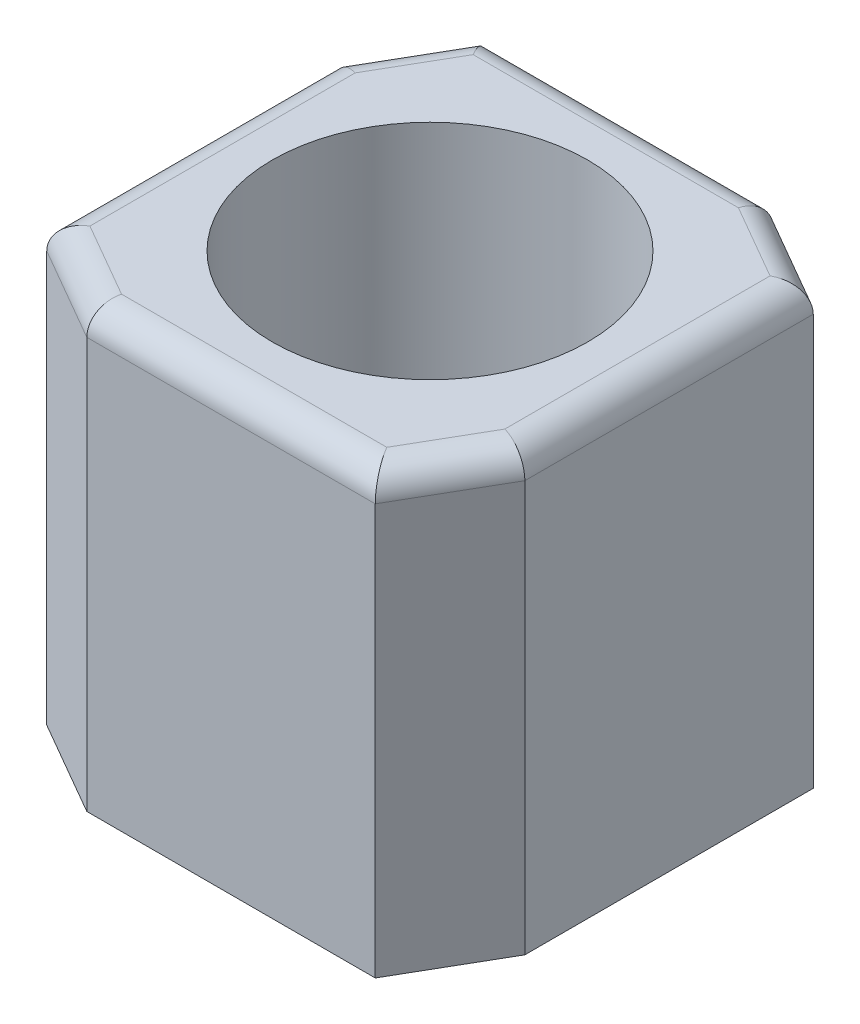
ISO-10303-21;
HEADER;
FILE_DESCRIPTION(('STEP AP214'),'2;1');
FILE_NAME('part.step','',(''),(''),'','','');
FILE_SCHEMA(('AUTOMOTIVE_DESIGN { 1 0 10303 214 1 1 1 1 }'));
ENDSEC;
DATA;
#1=APPLICATION_CONTEXT('core data for automotive mechanical design processes');
#2=APPLICATION_PROTOCOL_DEFINITION('international standard','automotive_design',2000,#1);
#3=PRODUCT_CONTEXT('',#1,'mechanical');
#4=PRODUCT('Part','Part','',(#3));
#5=PRODUCT_RELATED_PRODUCT_CATEGORY('part','',(#4));
#6=PRODUCT_DEFINITION_FORMATION('','',#4);
#7=PRODUCT_DEFINITION_CONTEXT('part definition',#1,'design');
#8=PRODUCT_DEFINITION('design','',#6,#7);
#9=PRODUCT_DEFINITION_SHAPE('','',#8);
#10=(LENGTH_UNIT() NAMED_UNIT(*) SI_UNIT(.MILLI.,.METRE.));
#11=(NAMED_UNIT(*) PLANE_ANGLE_UNIT() SI_UNIT($,.RADIAN.));
#12=(NAMED_UNIT(*) SI_UNIT($,.STERADIAN.) SOLID_ANGLE_UNIT());
#13=UNCERTAINTY_MEASURE_WITH_UNIT(LENGTH_MEASURE(1.E-05),#10,'distance_accuracy_value','');
#14=(GEOMETRIC_REPRESENTATION_CONTEXT(3) GLOBAL_UNCERTAINTY_ASSIGNED_CONTEXT((#13)) GLOBAL_UNIT_ASSIGNED_CONTEXT((#10,
#11,#12)) REPRESENTATION_CONTEXT('',''));
#15=CARTESIAN_POINT('',(0.,0.,0.));
#16=DIRECTION('',(0.,0.,1.));
#17=DIRECTION('',(1.,0.,0.));
#18=AXIS2_PLACEMENT_3D('',#15,#16,#17);
#19=CARTESIAN_POINT('',(0.,6.35,0.));
#20=DIRECTION('',(0.,-1.,0.));
#21=DIRECTION('',(0.,0.,-1.));
#22=AXIS2_PLACEMENT_3D('',#19,#20,#21);
#23=PLANE('',#22);
#24=DIRECTION('',(-1.,0.,0.));
#25=VECTOR('',#24,1.);
#26=CARTESIAN_POINT('',(0.,6.35,-2.778125));
#27=LINE('',#26,#25);
#28=CARTESIAN_POINT('',(1.6938423357461,6.35,-2.778125));
#29=VERTEX_POINT('',#28);
#30=CARTESIAN_POINT('',(-2.15211411191536,6.35,-2.778125));
#31=VERTEX_POINT('',#30);
#32=EDGE_CURVE('E198',#29,#31,#27,.T.);
#33=ORIENTED_EDGE('',*,*,#32,.T.);
#34=DIRECTION('',(0.500000000000001,0.,-0.866025403784438));
#35=VECTOR('',#34,1.);
#36=CARTESIAN_POINT('',(-2.83129616787305,6.35,-1.6017471714922));
#37=LINE('',#36,#35);
#38=CARTESIAN_POINT('',(-2.778125,6.35,-1.6938423357461));
#39=VERTEX_POINT('',#38);
#40=EDGE_CURVE('E200',#31,#39,#37,.F.);
#41=ORIENTED_EDGE('',*,*,#40,.T.);
#42=DIRECTION('',(0.,0.,1.));
#43=VECTOR('',#42,1.);
#44=CARTESIAN_POINT('',(-2.778125,6.35,0.));
#45=LINE('',#44,#43);
#46=CARTESIAN_POINT('',(-2.778125,6.35,2.15211411191536));
#47=VERTEX_POINT('',#46);
#48=EDGE_CURVE('E191',#39,#47,#45,.T.);
#49=ORIENTED_EDGE('',*,*,#48,.T.);
#50=DIRECTION('',(-0.866025403784438,0.,-0.500000000000001));
#51=VECTOR('',#50,1.);
#52=CARTESIAN_POINT('',(-1.6017471714922,6.35,2.83129616787305));
#53=LINE('',#52,#51);
#54=CARTESIAN_POINT('',(-1.6938423357461,6.35,2.778125));
#55=VERTEX_POINT('',#54);
#56=EDGE_CURVE('E185',#47,#55,#53,.F.);
#57=ORIENTED_EDGE('',*,*,#56,.T.);
#58=DIRECTION('',(1.,0.,0.));
#59=VECTOR('',#58,1.);
#60=CARTESIAN_POINT('',(0.,6.35,2.778125));
#61=LINE('',#60,#59);
#62=CARTESIAN_POINT('',(2.15211411191537,6.35,2.778125));
#63=VERTEX_POINT('',#62);
#64=EDGE_CURVE('E187',#55,#63,#61,.T.);
#65=ORIENTED_EDGE('',*,*,#64,.T.);
#66=DIRECTION('',(-0.500000000000001,0.,0.866025403784438));
#67=VECTOR('',#66,1.);
#68=CARTESIAN_POINT('',(2.83129616787305,6.35,1.6017471714922));
#69=LINE('',#68,#67);
#70=CARTESIAN_POINT('',(2.778125,6.35,1.6938423357461));
#71=VERTEX_POINT('',#70);
#72=EDGE_CURVE('E189',#63,#71,#69,.F.);
#73=ORIENTED_EDGE('',*,*,#72,.T.);
#74=DIRECTION('',(0.,0.,-1.));
#75=VECTOR('',#74,1.);
#76=CARTESIAN_POINT('',(2.778125,6.35,0.));
#77=LINE('',#76,#75);
#78=CARTESIAN_POINT('',(2.778125,6.35,-2.15211411191537));
#79=VERTEX_POINT('',#78);
#80=EDGE_CURVE('E193',#71,#79,#77,.T.);
#81=ORIENTED_EDGE('',*,*,#80,.T.);
#82=DIRECTION('',(0.866025403784438,0.,0.5));
#83=VECTOR('',#82,1.);
#84=CARTESIAN_POINT('',(1.6017471714922,6.35,-2.83129616787305));
#85=LINE('',#84,#83);
#86=EDGE_CURVE('E196',#79,#29,#85,.F.);
#87=ORIENTED_EDGE('',*,*,#86,.T.);
#88=EDGE_LOOP('',(#33,#41,#49,#57,#65,#73,#81,#87));
#89=FACE_BOUND('',#88,.T.);
#90=CARTESIAN_POINT('',(0.,6.35,0.));
#91=DIRECTION('',(0.,1.,0.));
#92=DIRECTION('',(0.,0.,1.));
#93=AXIS2_PLACEMENT_3D('',#90,#91,#92);
#94=CIRCLE('',#93,2.286);
#95=CARTESIAN_POINT('',(0.,6.35,2.286));
#96=VERTEX_POINT('',#95);
#97=EDGE_CURVE('E237',#96,#96,#94,.T.);
#98=ORIENTED_EDGE('',*,*,#97,.F.);
#99=EDGE_LOOP('',(#98));
#100=FACE_BOUND('',#99,.T.);
#101=ADVANCED_FACE('F41',(#89,#100),#23,.F.);
#102=CARTESIAN_POINT('',(0.,0.,0.));
#103=DIRECTION('',(0.,-1.,0.));
#104=DIRECTION('',(0.,0.,-1.));
#105=AXIS2_PLACEMENT_3D('',#102,#103,#104);
#106=PLANE('',#105);
#107=CARTESIAN_POINT('',(0.,0.,0.));
#108=DIRECTION('',(0.,-1.,0.));
#109=DIRECTION('',(0.,0.,-1.));
#110=AXIS2_PLACEMENT_3D('',#107,#108,#109);
#111=CIRCLE('',#110,2.682875);
#112=CARTESIAN_POINT('',(0.,0.,-2.682875));
#113=VERTEX_POINT('',#112);
#114=EDGE_CURVE('E49',#113,#113,#111,.F.);
#115=ORIENTED_EDGE('',*,*,#114,.T.);
#116=EDGE_LOOP('',(#115));
#117=FACE_BOUND('',#116,.T.);
#118=DIRECTION('',(0.,0.,1.));
#119=VECTOR('',#118,1.);
#120=CARTESIAN_POINT('',(-3.175,0.,3.175));
#121=LINE('',#120,#119);
#122=CARTESIAN_POINT('',(-3.175,0.,-1.8001846714922));
#123=VERTEX_POINT('',#122);
#124=CARTESIAN_POINT('',(-3.175,0.,2.38125));
#125=VERTEX_POINT('',#124);
#126=EDGE_CURVE('E137',#123,#125,#121,.T.);
#127=ORIENTED_EDGE('',*,*,#126,.F.);
#128=DIRECTION('',(-0.500000000000001,0.,0.866025403784438));
#129=VECTOR('',#128,1.);
#130=CARTESIAN_POINT('',(-3.16075282850779,0.,-1.82486149638085));
#131=LINE('',#130,#129);
#132=CARTESIAN_POINT('',(-2.38125,0.,-3.175));
#133=VERTEX_POINT('',#132);
#134=EDGE_CURVE('E147',#123,#133,#131,.F.);
#135=ORIENTED_EDGE('',*,*,#134,.T.);
#136=DIRECTION('',(-1.,0.,0.));
#137=VECTOR('',#136,1.);
#138=CARTESIAN_POINT('',(-3.175,0.,-3.175));
#139=LINE('',#138,#137);
#140=CARTESIAN_POINT('',(1.8001846714922,0.,-3.175));
#141=VERTEX_POINT('',#140);
#142=EDGE_CURVE('E161',#141,#133,#139,.T.);
#143=ORIENTED_EDGE('',*,*,#142,.F.);
#144=DIRECTION('',(-0.866025403784438,0.,-0.5));
#145=VECTOR('',#144,1.);
#146=CARTESIAN_POINT('',(1.82486149638085,0.,-3.1607528285078));
#147=LINE('',#146,#145);
#148=CARTESIAN_POINT('',(3.175,0.,-2.38125));
#149=VERTEX_POINT('',#148);
#150=EDGE_CURVE('E155',#141,#149,#147,.F.);
#151=ORIENTED_EDGE('',*,*,#150,.T.);
#152=DIRECTION('',(0.,0.,-1.));
#153=VECTOR('',#152,1.);
#154=CARTESIAN_POINT('',(3.175,0.,3.175));
#155=LINE('',#154,#153);
#156=CARTESIAN_POINT('',(3.175,0.,1.8001846714922));
#157=VERTEX_POINT('',#156);
#158=EDGE_CURVE('E165',#157,#149,#155,.T.);
#159=ORIENTED_EDGE('',*,*,#158,.F.);
#160=DIRECTION('',(0.500000000000001,0.,-0.866025403784438));
#161=VECTOR('',#160,1.);
#162=CARTESIAN_POINT('',(3.16075282850779,0.,1.82486149638085));
#163=LINE('',#162,#161);
#164=CARTESIAN_POINT('',(2.38125,0.,3.175));
#165=VERTEX_POINT('',#164);
#166=EDGE_CURVE('E171',#157,#165,#163,.F.);
#167=ORIENTED_EDGE('',*,*,#166,.T.);
#168=DIRECTION('',(1.,0.,0.));
#169=VECTOR('',#168,1.);
#170=CARTESIAN_POINT('',(-3.175,0.,3.175));
#171=LINE('',#170,#169);
#172=CARTESIAN_POINT('',(-1.8001846714922,0.,3.175));
#173=VERTEX_POINT('',#172);
#174=EDGE_CURVE('E160',#173,#165,#171,.T.);
#175=ORIENTED_EDGE('',*,*,#174,.F.);
#176=DIRECTION('',(0.866025403784438,0.,0.500000000000001));
#177=VECTOR('',#176,1.);
#178=CARTESIAN_POINT('',(-1.82486149638085,0.,3.16075282850779));
#179=LINE('',#178,#177);
#180=EDGE_CURVE('E143',#173,#125,#179,.F.);
#181=ORIENTED_EDGE('',*,*,#180,.T.);
#182=EDGE_LOOP('',(#127,#135,#143,#151,#159,#167,#175,#181));
#183=FACE_BOUND('',#182,.T.);
#184=ADVANCED_FACE('F157',(#117,#183),#106,.T.);
#185=CARTESIAN_POINT('',(3.175,6.35,3.175));
#186=DIRECTION('',(-1.,0.,0.));
#187=DIRECTION('',(0.,0.,1.));
#188=AXIS2_PLACEMENT_3D('',#185,#186,#187);
#189=PLANE('',#188);
#190=DIRECTION('',(0.,1.,0.));
#191=VECTOR('',#190,1.);
#192=CARTESIAN_POINT('',(3.175,6.35,-2.38125));
#193=LINE('',#192,#191);
#194=CARTESIAN_POINT('',(3.175,5.953125,-2.38125));
#195=VERTEX_POINT('',#194);
#196=EDGE_CURVE('E178',#149,#195,#193,.T.);
#197=ORIENTED_EDGE('',*,*,#196,.T.);
#198=DIRECTION('',(0.,0.,-1.));
#199=VECTOR('',#198,1.);
#200=CARTESIAN_POINT('',(3.175,5.953125,3.175));
#201=LINE('',#200,#199);
#202=CARTESIAN_POINT('',(3.175,5.953125,1.8001846714922));
#203=VERTEX_POINT('',#202);
#204=EDGE_CURVE('E202',#195,#203,#201,.F.);
#205=ORIENTED_EDGE('',*,*,#204,.T.);
#206=DIRECTION('',(0.,-1.,0.));
#207=VECTOR('',#206,1.);
#208=CARTESIAN_POINT('',(3.175,6.35,1.8001846714922));
#209=LINE('',#208,#207);
#210=EDGE_CURVE('E176',#203,#157,#209,.T.);
#211=ORIENTED_EDGE('',*,*,#210,.T.);
#212=ORIENTED_EDGE('',*,*,#158,.T.);
#213=EDGE_LOOP('',(#197,#205,#211,#212));
#214=FACE_BOUND('',#213,.T.);
#215=ADVANCED_FACE('F260',(#214),#189,.F.);
#216=CARTESIAN_POINT('',(-3.175,6.35,-3.175));
#217=DIRECTION('',(0.,0.,1.));
#218=DIRECTION('',(1.,0.,0.));
#219=AXIS2_PLACEMENT_3D('',#216,#217,#218);
#220=PLANE('',#219);
#221=DIRECTION('',(0.,1.,0.));
#222=VECTOR('',#221,1.);
#223=CARTESIAN_POINT('',(-2.38125,6.35,-3.175));
#224=LINE('',#223,#222);
#225=CARTESIAN_POINT('',(-2.38125,5.953125,-3.175));
#226=VERTEX_POINT('',#225);
#227=EDGE_CURVE('E150',#133,#226,#224,.T.);
#228=ORIENTED_EDGE('',*,*,#227,.T.);
#229=DIRECTION('',(-1.,0.,0.));
#230=VECTOR('',#229,1.);
#231=CARTESIAN_POINT('',(-3.175,5.953125,-3.175));
#232=LINE('',#231,#230);
#233=CARTESIAN_POINT('',(1.8001846714922,5.953125,-3.175));
#234=VERTEX_POINT('',#233);
#235=EDGE_CURVE('E208',#226,#234,#232,.F.);
#236=ORIENTED_EDGE('',*,*,#235,.T.);
#237=DIRECTION('',(0.,-1.,0.));
#238=VECTOR('',#237,1.);
#239=CARTESIAN_POINT('',(1.8001846714922,6.35,-3.175));
#240=LINE('',#239,#238);
#241=EDGE_CURVE('E154',#234,#141,#240,.T.);
#242=ORIENTED_EDGE('',*,*,#241,.T.);
#243=ORIENTED_EDGE('',*,*,#142,.T.);
#244=EDGE_LOOP('',(#228,#236,#242,#243));
#245=FACE_BOUND('',#244,.T.);
#246=ADVANCED_FACE('F271',(#245),#220,.F.);
#247=CARTESIAN_POINT('',(-3.175,6.35,3.175));
#248=DIRECTION('',(1.,0.,0.));
#249=DIRECTION('',(0.,0.,-1.));
#250=AXIS2_PLACEMENT_3D('',#247,#248,#249);
#251=PLANE('',#250);
#252=DIRECTION('',(0.,1.,0.));
#253=VECTOR('',#252,1.);
#254=CARTESIAN_POINT('',(-3.175,6.35,2.38125));
#255=LINE('',#254,#253);
#256=CARTESIAN_POINT('',(-3.175,5.953125,2.38125));
#257=VERTEX_POINT('',#256);
#258=EDGE_CURVE('E144',#125,#257,#255,.T.);
#259=ORIENTED_EDGE('',*,*,#258,.T.);
#260=DIRECTION('',(0.,0.,1.));
#261=VECTOR('',#260,1.);
#262=CARTESIAN_POINT('',(-3.175,5.953125,3.175));
#263=LINE('',#262,#261);
#264=CARTESIAN_POINT('',(-3.175,5.953125,-1.8001846714922));
#265=VERTEX_POINT('',#264);
#266=EDGE_CURVE('E140',#257,#265,#263,.F.);
#267=ORIENTED_EDGE('',*,*,#266,.T.);
#268=DIRECTION('',(0.,-1.,0.));
#269=VECTOR('',#268,1.);
#270=CARTESIAN_POINT('',(-3.175,6.35,-1.8001846714922));
#271=LINE('',#270,#269);
#272=EDGE_CURVE('E132',#265,#123,#271,.T.);
#273=ORIENTED_EDGE('',*,*,#272,.T.);
#274=ORIENTED_EDGE('',*,*,#126,.T.);
#275=EDGE_LOOP('',(#259,#267,#273,#274));
#276=FACE_BOUND('',#275,.T.);
#277=ADVANCED_FACE('F135',(#276),#251,.F.);
#278=CARTESIAN_POINT('',(-3.175,6.35,3.175));
#279=DIRECTION('',(0.,0.,-1.));
#280=DIRECTION('',(-1.,0.,0.));
#281=AXIS2_PLACEMENT_3D('',#278,#279,#280);
#282=PLANE('',#281);
#283=DIRECTION('',(0.,1.,0.));
#284=VECTOR('',#283,1.);
#285=CARTESIAN_POINT('',(2.38125,6.35,3.175));
#286=LINE('',#285,#284);
#287=CARTESIAN_POINT('',(2.38125,5.953125,3.175));
#288=VERTEX_POINT('',#287);
#289=EDGE_CURVE('E183',#165,#288,#286,.T.);
#290=ORIENTED_EDGE('',*,*,#289,.T.);
#291=DIRECTION('',(1.,0.,0.));
#292=VECTOR('',#291,1.);
#293=CARTESIAN_POINT('',(-3.175,5.953125,3.175));
#294=LINE('',#293,#292);
#295=CARTESIAN_POINT('',(-1.8001846714922,5.953125,3.175));
#296=VERTEX_POINT('',#295);
#297=EDGE_CURVE('E56',#288,#296,#294,.F.);
#298=ORIENTED_EDGE('',*,*,#297,.T.);
#299=DIRECTION('',(0.,-1.,0.));
#300=VECTOR('',#299,1.);
#301=CARTESIAN_POINT('',(-1.8001846714922,6.35,3.175));
#302=LINE('',#301,#300);
#303=EDGE_CURVE('E181',#296,#173,#302,.T.);
#304=ORIENTED_EDGE('',*,*,#303,.T.);
#305=ORIENTED_EDGE('',*,*,#174,.T.);
#306=EDGE_LOOP('',(#290,#298,#304,#305));
#307=FACE_BOUND('',#306,.T.);
#308=ADVANCED_FACE('F266',(#307),#282,.F.);
#309=CARTESIAN_POINT('',(0.,6.35,0.));
#310=DIRECTION('',(0.,-1.,0.));
#311=DIRECTION('',(0.,0.,-1.));
#312=AXIS2_PLACEMENT_3D('',#309,#310,#311);
#313=CYLINDRICAL_SURFACE('',#312,2.286);
#314=CARTESIAN_POINT('',(0.,0.396875,0.));
#315=DIRECTION('',(0.,-1.,0.));
#316=DIRECTION('',(0.,0.,-1.));
#317=AXIS2_PLACEMENT_3D('',#314,#315,#316);
#318=CIRCLE('',#317,2.286);
#319=CARTESIAN_POINT('',(0.,0.396875,-2.286));
#320=VERTEX_POINT('',#319);
#321=EDGE_CURVE('E11',#320,#320,#318,.T.);
#322=ORIENTED_EDGE('',*,*,#321,.T.);
#323=EDGE_LOOP('',(#322));
#324=FACE_BOUND('',#323,.T.);
#325=ORIENTED_EDGE('',*,*,#97,.T.);
#326=EDGE_LOOP('',(#325));
#327=FACE_BOUND('',#326,.T.);
#328=ADVANCED_FACE('F264',(#324,#327),#313,.F.);
#329=CARTESIAN_POINT('',(-3.175,6.35,-1.8001846714922));
#330=DIRECTION('',(0.866025403784438,0.,0.500000000000001));
#331=DIRECTION('',(0.,-1.,0.));
#332=AXIS2_PLACEMENT_3D('',#329,#330,#331);
#333=PLANE('',#332);
#334=ORIENTED_EDGE('',*,*,#272,.F.);
#335=DIRECTION('',(-0.500000000000001,0.,0.866025403784438));
#336=VECTOR('',#335,1.);
#337=CARTESIAN_POINT('',(-2.38125,5.953125,-3.175));
#338=LINE('',#337,#336);
#339=EDGE_CURVE('E206',#265,#226,#338,.F.);
#340=ORIENTED_EDGE('',*,*,#339,.T.);
#341=ORIENTED_EDGE('',*,*,#227,.F.);
#342=ORIENTED_EDGE('',*,*,#134,.F.);
#343=EDGE_LOOP('',(#334,#340,#341,#342));
#344=FACE_BOUND('',#343,.T.);
#345=ADVANCED_FACE('F148',(#344),#333,.F.);
#346=CARTESIAN_POINT('',(1.8001846714922,6.35,-3.175));
#347=DIRECTION('',(-0.5,0.,0.866025403784438));
#348=DIRECTION('',(0.,-1.,0.));
#349=AXIS2_PLACEMENT_3D('',#346,#347,#348);
#350=PLANE('',#349);
#351=ORIENTED_EDGE('',*,*,#241,.F.);
#352=DIRECTION('',(-0.866025403784438,0.,-0.5));
#353=VECTOR('',#352,1.);
#354=CARTESIAN_POINT('',(3.175,5.953125,-2.38125));
#355=LINE('',#354,#353);
#356=EDGE_CURVE('E210',#234,#195,#355,.F.);
#357=ORIENTED_EDGE('',*,*,#356,.T.);
#358=ORIENTED_EDGE('',*,*,#196,.F.);
#359=ORIENTED_EDGE('',*,*,#150,.F.);
#360=EDGE_LOOP('',(#351,#357,#358,#359));
#361=FACE_BOUND('',#360,.T.);
#362=ADVANCED_FACE('F283',(#361),#350,.F.);
#363=CARTESIAN_POINT('',(3.175,6.35,1.8001846714922));
#364=DIRECTION('',(-0.866025403784438,0.,-0.500000000000001));
#365=DIRECTION('',(0.,-1.,0.));
#366=AXIS2_PLACEMENT_3D('',#363,#364,#365);
#367=PLANE('',#366);
#368=ORIENTED_EDGE('',*,*,#210,.F.);
#369=DIRECTION('',(0.500000000000001,0.,-0.866025403784438));
#370=VECTOR('',#369,1.);
#371=CARTESIAN_POINT('',(2.38125,5.953125,3.175));
#372=LINE('',#371,#370);
#373=EDGE_CURVE('E64',#203,#288,#372,.F.);
#374=ORIENTED_EDGE('',*,*,#373,.T.);
#375=ORIENTED_EDGE('',*,*,#289,.F.);
#376=ORIENTED_EDGE('',*,*,#166,.F.);
#377=EDGE_LOOP('',(#368,#374,#375,#376));
#378=FACE_BOUND('',#377,.T.);
#379=ADVANCED_FACE('F289',(#378),#367,.F.);
#380=CARTESIAN_POINT('',(-1.8001846714922,6.35,3.175));
#381=DIRECTION('',(0.500000000000001,0.,-0.866025403784438));
#382=DIRECTION('',(0.,-1.,0.));
#383=AXIS2_PLACEMENT_3D('',#380,#381,#382);
#384=PLANE('',#383);
#385=ORIENTED_EDGE('',*,*,#303,.F.);
#386=DIRECTION('',(0.866025403784438,0.,0.500000000000001));
#387=VECTOR('',#386,1.);
#388=CARTESIAN_POINT('',(-3.175,5.953125,2.38125));
#389=LINE('',#388,#387);
#390=EDGE_CURVE('E214',#296,#257,#389,.F.);
#391=ORIENTED_EDGE('',*,*,#390,.T.);
#392=ORIENTED_EDGE('',*,*,#258,.F.);
#393=ORIENTED_EDGE('',*,*,#180,.F.);
#394=EDGE_LOOP('',(#385,#391,#392,#393));
#395=FACE_BOUND('',#394,.T.);
#396=ADVANCED_FACE('F296',(#395),#384,.F.);
#397=CARTESIAN_POINT('',(-2.778125,5.953125,0.));
#398=DIRECTION('',(0.,0.,1.));
#399=DIRECTION('',(1.,0.,0.));
#400=AXIS2_PLACEMENT_3D('',#397,#398,#399);
#401=CYLINDRICAL_SURFACE('',#400,0.396875);
#402=CARTESIAN_POINT('',(-2.778125,5.953125,-1.6938423357461));
#403=DIRECTION('',(-0.258819045102521,0.,0.965925826289068));
#404=DIRECTION('',(-0.965925826289068,0.,-0.258819045102521));
#405=AXIS2_PLACEMENT_3D('',#402,#403,#404);
#406=ELLIPSE('',#405,0.410875234100252,0.396875);
#407=EDGE_CURVE('E232',#265,#39,#406,.F.);
#408=ORIENTED_EDGE('',*,*,#407,.F.);
#409=ORIENTED_EDGE('',*,*,#266,.F.);
#410=CARTESIAN_POINT('',(-2.778125,5.953125,2.15211411191536));
#411=DIRECTION('',(0.5,0.,0.866025403784439));
#412=DIRECTION('',(0.866025403784439,0.,-0.5));
#413=AXIS2_PLACEMENT_3D('',#410,#411,#412);
#414=ELLIPSE('',#413,0.458271776169265,0.396875);
#415=EDGE_CURVE('E235',#47,#257,#414,.T.);
#416=ORIENTED_EDGE('',*,*,#415,.F.);
#417=ORIENTED_EDGE('',*,*,#48,.F.);
#418=EDGE_LOOP('',(#408,#409,#416,#417));
#419=FACE_BOUND('',#418,.T.);
#420=ADVANCED_FACE('F300',(#419),#401,.T.);
#421=CARTESIAN_POINT('',(-1.62642399638085,5.953125,2.81704899638084));
#422=DIRECTION('',(0.866025403784438,0.,0.500000000000001));
#423=DIRECTION('',(0.500000000000001,0.,-0.866025403784438));
#424=AXIS2_PLACEMENT_3D('',#421,#422,#423);
#425=CYLINDRICAL_SURFACE('',#424,0.396875);
#426=ORIENTED_EDGE('',*,*,#415,.T.);
#427=ORIENTED_EDGE('',*,*,#390,.F.);
#428=CARTESIAN_POINT('',(-1.6938423357461,5.953125,2.778125));
#429=DIRECTION('',(0.965925826289068,0.,0.258819045102521));
#430=DIRECTION('',(-0.258819045102521,0.,0.965925826289068));
#431=AXIS2_PLACEMENT_3D('',#428,#429,#430);
#432=ELLIPSE('',#431,0.410875234100252,0.396875);
#433=EDGE_CURVE('E229',#55,#296,#432,.T.);
#434=ORIENTED_EDGE('',*,*,#433,.F.);
#435=ORIENTED_EDGE('',*,*,#56,.F.);
#436=EDGE_LOOP('',(#426,#427,#434,#435));
#437=FACE_BOUND('',#436,.T.);
#438=ADVANCED_FACE('F321',(#437),#425,.T.);
#439=CARTESIAN_POINT('',(-2.81704899638084,5.953125,-1.62642399638085));
#440=DIRECTION('',(-0.500000000000001,0.,0.866025403784438));
#441=DIRECTION('',(0.866025403784438,0.,0.500000000000001));
#442=AXIS2_PLACEMENT_3D('',#439,#440,#441);
#443=CYLINDRICAL_SURFACE('',#442,0.396875);
#444=ORIENTED_EDGE('',*,*,#407,.T.);
#445=ORIENTED_EDGE('',*,*,#40,.F.);
#446=CARTESIAN_POINT('',(-2.15211411191536,5.953125,-2.778125));
#447=DIRECTION('',(-0.866025403784439,0.,0.5));
#448=DIRECTION('',(-0.5,0.,-0.866025403784439));
#449=AXIS2_PLACEMENT_3D('',#446,#447,#448);
#450=ELLIPSE('',#449,0.458271776169265,0.396875);
#451=EDGE_CURVE('E226',#226,#31,#450,.F.);
#452=ORIENTED_EDGE('',*,*,#451,.F.);
#453=ORIENTED_EDGE('',*,*,#339,.F.);
#454=EDGE_LOOP('',(#444,#445,#452,#453));
#455=FACE_BOUND('',#454,.T.);
#456=ADVANCED_FACE('F317',(#455),#443,.T.);
#457=CARTESIAN_POINT('',(0.,5.953125,2.778125));
#458=DIRECTION('',(1.,0.,0.));
#459=DIRECTION('',(0.,0.,-1.));
#460=AXIS2_PLACEMENT_3D('',#457,#458,#459);
#461=CYLINDRICAL_SURFACE('',#460,0.396875);
#462=ORIENTED_EDGE('',*,*,#433,.T.);
#463=ORIENTED_EDGE('',*,*,#297,.F.);
#464=CARTESIAN_POINT('',(2.15211411191537,5.953125,2.778125));
#465=DIRECTION('',(0.866025403784439,0.,-0.5));
#466=DIRECTION('',(0.5,0.,0.866025403784439));
#467=AXIS2_PLACEMENT_3D('',#464,#465,#466);
#468=ELLIPSE('',#467,0.458271776169265,0.396875);
#469=EDGE_CURVE('E223',#63,#288,#468,.T.);
#470=ORIENTED_EDGE('',*,*,#469,.F.);
#471=ORIENTED_EDGE('',*,*,#64,.F.);
#472=EDGE_LOOP('',(#462,#463,#470,#471));
#473=FACE_BOUND('',#472,.T.);
#474=ADVANCED_FACE('F313',(#473),#461,.T.);
#475=CARTESIAN_POINT('',(0.,5.953125,-2.778125));
#476=DIRECTION('',(-1.,0.,0.));
#477=DIRECTION('',(0.,0.,1.));
#478=AXIS2_PLACEMENT_3D('',#475,#476,#477);
#479=CYLINDRICAL_SURFACE('',#478,0.396875);
#480=ORIENTED_EDGE('',*,*,#451,.T.);
#481=ORIENTED_EDGE('',*,*,#32,.F.);
#482=CARTESIAN_POINT('',(1.6938423357461,5.953125,-2.778125));
#483=DIRECTION('',(-0.965925826289068,0.,-0.258819045102521));
#484=DIRECTION('',(0.258819045102521,0.,-0.965925826289068));
#485=AXIS2_PLACEMENT_3D('',#482,#483,#484);
#486=ELLIPSE('',#485,0.410875234100252,0.396875);
#487=EDGE_CURVE('E220',#234,#29,#486,.F.);
#488=ORIENTED_EDGE('',*,*,#487,.F.);
#489=ORIENTED_EDGE('',*,*,#235,.F.);
#490=EDGE_LOOP('',(#480,#481,#488,#489));
#491=FACE_BOUND('',#490,.T.);
#492=ADVANCED_FACE('F309',(#491),#479,.T.);
#493=CARTESIAN_POINT('',(2.81704899638085,5.953125,1.62642399638085));
#494=DIRECTION('',(0.500000000000001,0.,-0.866025403784438));
#495=DIRECTION('',(-0.866025403784438,0.,-0.500000000000001));
#496=AXIS2_PLACEMENT_3D('',#493,#494,#495);
#497=CYLINDRICAL_SURFACE('',#496,0.396875);
#498=ORIENTED_EDGE('',*,*,#469,.T.);
#499=ORIENTED_EDGE('',*,*,#373,.F.);
#500=CARTESIAN_POINT('',(2.778125,5.953125,1.6938423357461));
#501=DIRECTION('',(0.258819045102521,0.,-0.965925826289068));
#502=DIRECTION('',(0.965925826289068,0.,0.258819045102521));
#503=AXIS2_PLACEMENT_3D('',#500,#501,#502);
#504=ELLIPSE('',#503,0.410875234100252,0.396875);
#505=EDGE_CURVE('E218',#71,#203,#504,.T.);
#506=ORIENTED_EDGE('',*,*,#505,.F.);
#507=ORIENTED_EDGE('',*,*,#72,.F.);
#508=EDGE_LOOP('',(#498,#499,#506,#507));
#509=FACE_BOUND('',#508,.T.);
#510=ADVANCED_FACE('F305',(#509),#497,.T.);
#511=CARTESIAN_POINT('',(1.62642399638085,5.953125,-2.81704899638085));
#512=DIRECTION('',(-0.866025403784438,0.,-0.5));
#513=DIRECTION('',(-0.5,0.,0.866025403784438));
#514=AXIS2_PLACEMENT_3D('',#511,#512,#513);
#515=CYLINDRICAL_SURFACE('',#514,0.396875);
#516=ORIENTED_EDGE('',*,*,#487,.T.);
#517=ORIENTED_EDGE('',*,*,#86,.F.);
#518=CARTESIAN_POINT('',(2.778125,5.953125,-2.15211411191537));
#519=DIRECTION('',(-0.5,0.,-0.866025403784439));
#520=DIRECTION('',(-0.866025403784439,0.,0.5));
#521=AXIS2_PLACEMENT_3D('',#518,#519,#520);
#522=ELLIPSE('',#521,0.458271776169265,0.396875);
#523=EDGE_CURVE('E216',#195,#79,#522,.F.);
#524=ORIENTED_EDGE('',*,*,#523,.F.);
#525=ORIENTED_EDGE('',*,*,#356,.F.);
#526=EDGE_LOOP('',(#516,#517,#524,#525));
#527=FACE_BOUND('',#526,.T.);
#528=ADVANCED_FACE('F249',(#527),#515,.T.);
#529=CARTESIAN_POINT('',(2.778125,5.953125,0.));
#530=DIRECTION('',(0.,0.,-1.));
#531=DIRECTION('',(-1.,0.,0.));
#532=AXIS2_PLACEMENT_3D('',#529,#530,#531);
#533=CYLINDRICAL_SURFACE('',#532,0.396875);
#534=ORIENTED_EDGE('',*,*,#505,.T.);
#535=ORIENTED_EDGE('',*,*,#204,.F.);
#536=ORIENTED_EDGE('',*,*,#523,.T.);
#537=ORIENTED_EDGE('',*,*,#80,.F.);
#538=EDGE_LOOP('',(#534,#535,#536,#537));
#539=FACE_BOUND('',#538,.T.);
#540=ADVANCED_FACE('F243',(#539),#533,.T.);
#541=CARTESIAN_POINT('',(0.,0.396875,0.));
#542=DIRECTION('',(0.,-1.,0.));
#543=DIRECTION('',(0.,0.,-1.));
#544=AXIS2_PLACEMENT_3D('',#541,#542,#543);
#545=TOROIDAL_SURFACE('',#544,2.682875,0.396875);
#546=ORIENTED_EDGE('',*,*,#321,.F.);
#547=EDGE_LOOP('',(#546));
#548=FACE_BOUND('',#547,.T.);
#549=ORIENTED_EDGE('',*,*,#114,.F.);
#550=EDGE_LOOP('',(#549));
#551=FACE_BOUND('',#550,.T.);
#552=ADVANCED_FACE('F43',(#548,#551),#545,.T.);
#553=CLOSED_SHELL('',(#101,#184,#215,#246,#277,#308,#328,#345,#362,#379,#396,#420,#438,#456,
#474,#492,#510,#528,#540,#552));
#554=MANIFOLD_SOLID_BREP('B2',#553);
#555=ADVANCED_BREP_SHAPE_REPRESENTATION('',(#18,#554),#14);
#556=SHAPE_DEFINITION_REPRESENTATION(#9,#555);
ENDSEC;
END-ISO-10303-21;
